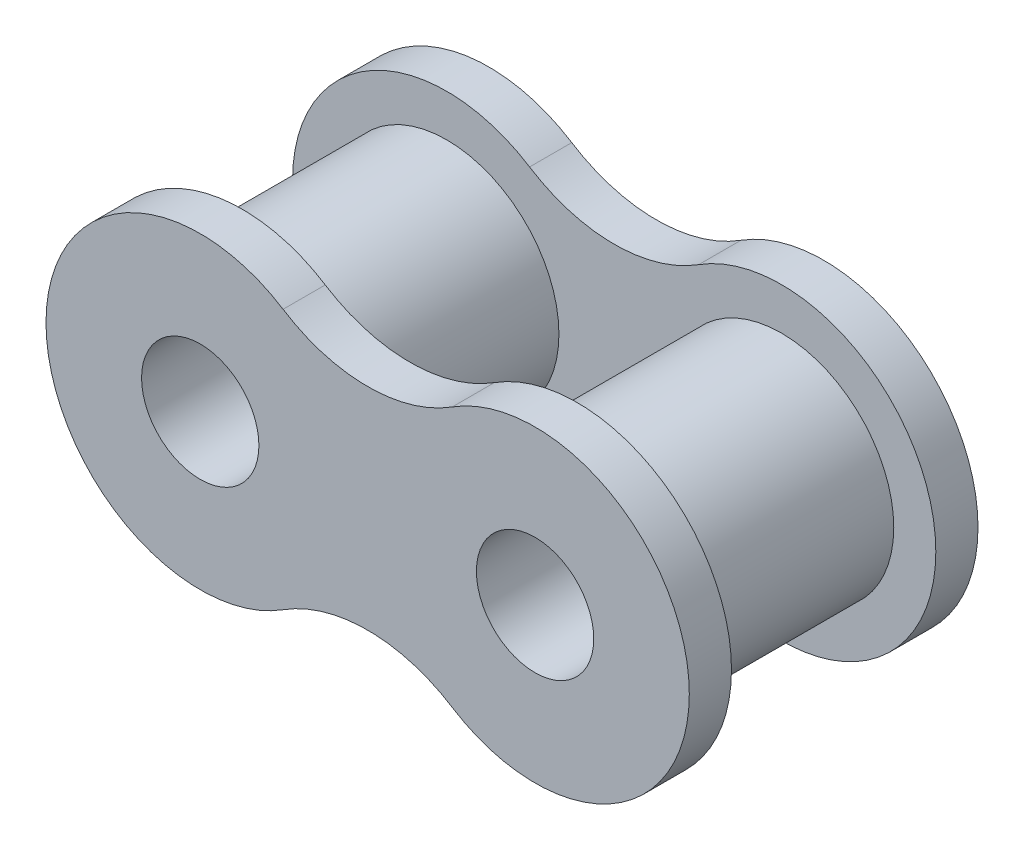
ISO-10303-21;
HEADER;
FILE_DESCRIPTION(('STEP AP214'),'2;1');
FILE_NAME('part.step','',(''),(''),'','','');
FILE_SCHEMA(('AUTOMOTIVE_DESIGN { 1 0 10303 214 1 1 1 1 }'));
ENDSEC;
DATA;
#1=APPLICATION_CONTEXT('core data for automotive mechanical design processes');
#2=APPLICATION_PROTOCOL_DEFINITION('international standard','automotive_design',2000,#1);
#3=PRODUCT_CONTEXT('',#1,'mechanical');
#4=PRODUCT('Part','Part','',(#3));
#5=PRODUCT_RELATED_PRODUCT_CATEGORY('part','',(#4));
#6=PRODUCT_DEFINITION_FORMATION('','',#4);
#7=PRODUCT_DEFINITION_CONTEXT('part definition',#1,'design');
#8=PRODUCT_DEFINITION('design','',#6,#7);
#9=PRODUCT_DEFINITION_SHAPE('','',#8);
#10=(LENGTH_UNIT() NAMED_UNIT(*) SI_UNIT(.MILLI.,.METRE.));
#11=(NAMED_UNIT(*) PLANE_ANGLE_UNIT() SI_UNIT($,.RADIAN.));
#12=(NAMED_UNIT(*) SI_UNIT($,.STERADIAN.) SOLID_ANGLE_UNIT());
#13=UNCERTAINTY_MEASURE_WITH_UNIT(LENGTH_MEASURE(1.E-05),#10,'distance_accuracy_value','');
#14=(GEOMETRIC_REPRESENTATION_CONTEXT(3) GLOBAL_UNCERTAINTY_ASSIGNED_CONTEXT((#13)) GLOBAL_UNIT_ASSIGNED_CONTEXT((#10,
#11,#12)) REPRESENTATION_CONTEXT('',''));
#15=CARTESIAN_POINT('',(0.,0.,0.));
#16=DIRECTION('',(0.,0.,1.));
#17=DIRECTION('',(1.,0.,0.));
#18=AXIS2_PLACEMENT_3D('',#15,#16,#17);
#19=CARTESIAN_POINT('',(-3.175,4.98650250676764,3.875));
#20=DIRECTION('',(0.,0.,1.));
#21=DIRECTION('',(1.,0.,0.));
#22=AXIS2_PLACEMENT_3D('',#19,#20,#21);
#23=PLANE('',#22);
#24=CARTESIAN_POINT('',(0.,0.,3.875));
#25=DIRECTION('',(0.,0.,1.));
#26=DIRECTION('',(1.,0.,0.));
#27=AXIS2_PLACEMENT_3D('',#24,#25,#26);
#28=CIRCLE('',#27,4.255);
#29=CARTESIAN_POINT('',(4.255,0.,3.875));
#30=VERTEX_POINT('',#29);
#31=EDGE_CURVE('E41',#30,#30,#28,.T.);
#32=ORIENTED_EDGE('',*,*,#31,.T.);
#33=EDGE_LOOP('',(#32));
#34=FACE_BOUND('',#33,.T.);
#35=CARTESIAN_POINT('',(-6.35,9.97300501353529,3.875));
#36=DIRECTION('',(0.,0.,-1.));
#37=DIRECTION('',(1.,0.,0.));
#38=AXIS2_PLACEMENT_3D('',#35,#36,#37);
#39=CIRCLE('',#38,5.973);
#40=CARTESIAN_POINT('',(-3.14196904339,4.93462567277184,3.875));
#41=VERTEX_POINT('',#40);
#42=CARTESIAN_POINT('',(-9.55803095661,4.93462567277184,3.875));
#43=VERTEX_POINT('',#42);
#44=EDGE_CURVE('E151',#41,#43,#39,.T.);
#45=ORIENTED_EDGE('',*,*,#44,.F.);
#46=CARTESIAN_POINT('',(0.,0.,3.875));
#47=DIRECTION('',(0.,0.,1.));
#48=DIRECTION('',(1.,0.,0.));
#49=AXIS2_PLACEMENT_3D('',#46,#47,#48);
#50=CIRCLE('',#49,5.85);
#51=CARTESIAN_POINT('',(-3.14196904339,-4.93462567277184,3.875));
#52=VERTEX_POINT('',#51);
#53=EDGE_CURVE('E73',#52,#41,#50,.T.);
#54=ORIENTED_EDGE('',*,*,#53,.F.);
#55=CARTESIAN_POINT('',(-6.35,-9.97300501353529,3.875));
#56=DIRECTION('',(0.,0.,-1.));
#57=DIRECTION('',(-1.,0.,0.));
#58=AXIS2_PLACEMENT_3D('',#55,#56,#57);
#59=CIRCLE('',#58,5.973);
#60=CARTESIAN_POINT('',(-9.55803095661,-4.93462567277184,3.875));
#61=VERTEX_POINT('',#60);
#62=EDGE_CURVE('E67',#61,#52,#59,.T.);
#63=ORIENTED_EDGE('',*,*,#62,.F.);
#64=CARTESIAN_POINT('',(-12.7,0.,3.875));
#65=DIRECTION('',(0.,0.,1.));
#66=DIRECTION('',(1.,0.,0.));
#67=AXIS2_PLACEMENT_3D('',#64,#65,#66);
#68=CIRCLE('',#67,5.85);
#69=EDGE_CURVE('E161',#43,#61,#68,.T.);
#70=ORIENTED_EDGE('',*,*,#69,.F.);
#71=EDGE_LOOP('',(#45,#54,#63,#70));
#72=FACE_BOUND('',#71,.T.);
#73=CARTESIAN_POINT('',(-12.7,0.,3.875));
#74=DIRECTION('',(0.,0.,1.));
#75=DIRECTION('',(1.,0.,0.));
#76=AXIS2_PLACEMENT_3D('',#73,#74,#75);
#77=CIRCLE('',#76,4.255);
#78=CARTESIAN_POINT('',(-8.445,0.,3.875));
#79=VERTEX_POINT('',#78);
#80=EDGE_CURVE('E11',#79,#79,#77,.F.);
#81=ORIENTED_EDGE('',*,*,#80,.F.);
#82=EDGE_LOOP('',(#81));
#83=FACE_BOUND('',#82,.T.);
#84=ADVANCED_FACE('F32',(#34,#72,#83),#23,.F.);
#85=CARTESIAN_POINT('',(0.,0.,3.875));
#86=DIRECTION('',(0.,0.,-1.));
#87=DIRECTION('',(-1.,0.,0.));
#88=AXIS2_PLACEMENT_3D('',#85,#86,#87);
#89=CYLINDRICAL_SURFACE('',#88,4.255);
#90=ORIENTED_EDGE('',*,*,#31,.F.);
#91=EDGE_LOOP('',(#90));
#92=FACE_BOUND('',#91,.T.);
#93=CARTESIAN_POINT('',(0.,0.,-3.875));
#94=DIRECTION('',(0.,0.,-1.));
#95=DIRECTION('',(-1.,0.,0.));
#96=AXIS2_PLACEMENT_3D('',#93,#94,#95);
#97=CIRCLE('',#96,4.255);
#98=CARTESIAN_POINT('',(-4.255,0.,-3.875));
#99=VERTEX_POINT('',#98);
#100=EDGE_CURVE('E137',#99,#99,#97,.T.);
#101=ORIENTED_EDGE('',*,*,#100,.F.);
#102=EDGE_LOOP('',(#101));
#103=FACE_BOUND('',#102,.T.);
#104=ADVANCED_FACE('F34',(#92,#103),#89,.T.);
#105=CARTESIAN_POINT('',(0.,0.,3.875));
#106=DIRECTION('',(0.,0.,-1.));
#107=DIRECTION('',(-1.,0.,0.));
#108=AXIS2_PLACEMENT_3D('',#105,#106,#107);
#109=CYLINDRICAL_SURFACE('',#108,2.225);
#110=CARTESIAN_POINT('',(0.,0.,5.475));
#111=DIRECTION('',(0.,0.,1.));
#112=DIRECTION('',(1.,0.,0.));
#113=AXIS2_PLACEMENT_3D('',#110,#111,#112);
#114=CIRCLE('',#113,2.225);
#115=CARTESIAN_POINT('',(2.225,0.,5.475));
#116=VERTEX_POINT('',#115);
#117=EDGE_CURVE('E148',#116,#116,#114,.T.);
#118=ORIENTED_EDGE('',*,*,#117,.T.);
#119=EDGE_LOOP('',(#118));
#120=FACE_BOUND('',#119,.T.);
#121=CARTESIAN_POINT('',(0.,0.,-5.475));
#122=DIRECTION('',(0.,0.,-1.));
#123=DIRECTION('',(-1.,0.,0.));
#124=AXIS2_PLACEMENT_3D('',#121,#122,#123);
#125=CIRCLE('',#124,2.225);
#126=CARTESIAN_POINT('',(-2.225,0.,-5.475));
#127=VERTEX_POINT('',#126);
#128=EDGE_CURVE('E227',#127,#127,#125,.T.);
#129=ORIENTED_EDGE('',*,*,#128,.T.);
#130=EDGE_LOOP('',(#129));
#131=FACE_BOUND('',#130,.T.);
#132=ADVANCED_FACE('F178',(#120,#131),#109,.F.);
#133=CARTESIAN_POINT('',(-3.175,4.98650250676764,5.475));
#134=DIRECTION('',(0.,0.,1.));
#135=DIRECTION('',(1.,0.,0.));
#136=AXIS2_PLACEMENT_3D('',#133,#134,#135);
#137=PLANE('',#136);
#138=ORIENTED_EDGE('',*,*,#117,.F.);
#139=EDGE_LOOP('',(#138));
#140=FACE_BOUND('',#139,.T.);
#141=CARTESIAN_POINT('',(-6.35,9.97300501353529,5.475));
#142=DIRECTION('',(0.,0.,-1.));
#143=DIRECTION('',(1.,0.,0.));
#144=AXIS2_PLACEMENT_3D('',#141,#142,#143);
#145=CIRCLE('',#144,5.973);
#146=CARTESIAN_POINT('',(-3.14196904339,4.93462567277184,5.475));
#147=VERTEX_POINT('',#146);
#148=CARTESIAN_POINT('',(-9.55803095661,4.93462567277184,5.475));
#149=VERTEX_POINT('',#148);
#150=EDGE_CURVE('E152',#147,#149,#145,.T.);
#151=ORIENTED_EDGE('',*,*,#150,.T.);
#152=CARTESIAN_POINT('',(-12.7,0.,5.475));
#153=DIRECTION('',(0.,0.,1.));
#154=DIRECTION('',(1.,0.,0.));
#155=AXIS2_PLACEMENT_3D('',#152,#153,#154);
#156=CIRCLE('',#155,5.85);
#157=CARTESIAN_POINT('',(-9.55803095661,-4.93462567277184,5.475));
#158=VERTEX_POINT('',#157);
#159=EDGE_CURVE('E81',#149,#158,#156,.T.);
#160=ORIENTED_EDGE('',*,*,#159,.T.);
#161=CARTESIAN_POINT('',(-6.35,-9.97300501353529,5.475));
#162=DIRECTION('',(0.,0.,-1.));
#163=DIRECTION('',(-1.,0.,0.));
#164=AXIS2_PLACEMENT_3D('',#161,#162,#163);
#165=CIRCLE('',#164,5.973);
#166=CARTESIAN_POINT('',(-3.14196904339,-4.93462567277184,5.475));
#167=VERTEX_POINT('',#166);
#168=EDGE_CURVE('E155',#158,#167,#165,.T.);
#169=ORIENTED_EDGE('',*,*,#168,.T.);
#170=CARTESIAN_POINT('',(0.,0.,5.475));
#171=DIRECTION('',(0.,0.,1.));
#172=DIRECTION('',(1.,0.,0.));
#173=AXIS2_PLACEMENT_3D('',#170,#171,#172);
#174=CIRCLE('',#173,5.85);
#175=EDGE_CURVE('E49',#167,#147,#174,.T.);
#176=ORIENTED_EDGE('',*,*,#175,.T.);
#177=EDGE_LOOP('',(#151,#160,#169,#176));
#178=FACE_BOUND('',#177,.T.);
#179=CARTESIAN_POINT('',(-12.7,0.,5.475));
#180=DIRECTION('',(0.,0.,1.));
#181=DIRECTION('',(1.,0.,0.));
#182=AXIS2_PLACEMENT_3D('',#179,#180,#181);
#183=CIRCLE('',#182,2.225);
#184=CARTESIAN_POINT('',(-10.475,0.,5.475));
#185=VERTEX_POINT('',#184);
#186=EDGE_CURVE('E145',#185,#185,#183,.T.);
#187=ORIENTED_EDGE('',*,*,#186,.F.);
#188=EDGE_LOOP('',(#187));
#189=FACE_BOUND('',#188,.T.);
#190=ADVANCED_FACE('F203',(#140,#178,#189),#137,.T.);
#191=CARTESIAN_POINT('',(-6.35,9.97300501353529,5.475));
#192=DIRECTION('',(0.,0.,-1.));
#193=DIRECTION('',(-1.,0.,0.));
#194=AXIS2_PLACEMENT_3D('',#191,#192,#193);
#195=CYLINDRICAL_SURFACE('',#194,5.973);
#196=ORIENTED_EDGE('',*,*,#44,.T.);
#197=DIRECTION('',(0.,0.,-1.));
#198=VECTOR('',#197,1.);
#199=CARTESIAN_POINT('',(-9.55803095661,4.93462567277184,5.475));
#200=LINE('',#199,#198);
#201=EDGE_CURVE('E170',#149,#43,#200,.T.);
#202=ORIENTED_EDGE('',*,*,#201,.F.);
#203=ORIENTED_EDGE('',*,*,#150,.F.);
#204=DIRECTION('',(0.,0.,-1.));
#205=VECTOR('',#204,1.);
#206=CARTESIAN_POINT('',(-3.14196904339,4.93462567277184,5.475));
#207=LINE('',#206,#205);
#208=EDGE_CURVE('E158',#147,#41,#207,.T.);
#209=ORIENTED_EDGE('',*,*,#208,.T.);
#210=EDGE_LOOP('',(#196,#202,#203,#209));
#211=FACE_BOUND('',#210,.T.);
#212=ADVANCED_FACE('F214',(#211),#195,.F.);
#213=CARTESIAN_POINT('',(-12.7,0.,5.475));
#214=DIRECTION('',(0.,0.,-1.));
#215=DIRECTION('',(-1.,0.,0.));
#216=AXIS2_PLACEMENT_3D('',#213,#214,#215);
#217=CYLINDRICAL_SURFACE('',#216,5.85);
#218=ORIENTED_EDGE('',*,*,#69,.T.);
#219=DIRECTION('',(0.,0.,-1.));
#220=VECTOR('',#219,1.);
#221=CARTESIAN_POINT('',(-9.55803095661,-4.93462567277184,5.475));
#222=LINE('',#221,#220);
#223=EDGE_CURVE('E168',#158,#61,#222,.T.);
#224=ORIENTED_EDGE('',*,*,#223,.F.);
#225=ORIENTED_EDGE('',*,*,#159,.F.);
#226=ORIENTED_EDGE('',*,*,#201,.T.);
#227=EDGE_LOOP('',(#218,#224,#225,#226));
#228=FACE_BOUND('',#227,.T.);
#229=ADVANCED_FACE('F211',(#228),#217,.T.);
#230=CARTESIAN_POINT('',(-6.35,-9.97300501353529,5.475));
#231=DIRECTION('',(0.,0.,-1.));
#232=DIRECTION('',(-1.,0.,0.));
#233=AXIS2_PLACEMENT_3D('',#230,#231,#232);
#234=CYLINDRICAL_SURFACE('',#233,5.973);
#235=ORIENTED_EDGE('',*,*,#62,.T.);
#236=DIRECTION('',(0.,0.,-1.));
#237=VECTOR('',#236,1.);
#238=CARTESIAN_POINT('',(-3.14196904339,-4.93462567277184,5.475));
#239=LINE('',#238,#237);
#240=EDGE_CURVE('E166',#167,#52,#239,.T.);
#241=ORIENTED_EDGE('',*,*,#240,.F.);
#242=ORIENTED_EDGE('',*,*,#168,.F.);
#243=ORIENTED_EDGE('',*,*,#223,.T.);
#244=EDGE_LOOP('',(#235,#241,#242,#243));
#245=FACE_BOUND('',#244,.T.);
#246=ADVANCED_FACE('F208',(#245),#234,.F.);
#247=CARTESIAN_POINT('',(0.,0.,5.475));
#248=DIRECTION('',(0.,0.,-1.));
#249=DIRECTION('',(-1.,0.,0.));
#250=AXIS2_PLACEMENT_3D('',#247,#248,#249);
#251=CYLINDRICAL_SURFACE('',#250,5.85);
#252=ORIENTED_EDGE('',*,*,#53,.T.);
#253=ORIENTED_EDGE('',*,*,#208,.F.);
#254=ORIENTED_EDGE('',*,*,#175,.F.);
#255=ORIENTED_EDGE('',*,*,#240,.T.);
#256=EDGE_LOOP('',(#252,#253,#254,#255));
#257=FACE_BOUND('',#256,.T.);
#258=ADVANCED_FACE('F205',(#257),#251,.T.);
#259=CARTESIAN_POINT('',(-12.7,0.,5.475));
#260=DIRECTION('',(0.,0.,-1.));
#261=DIRECTION('',(-1.,0.,0.));
#262=AXIS2_PLACEMENT_3D('',#259,#260,#261);
#263=CYLINDRICAL_SURFACE('',#262,2.225);
#264=ORIENTED_EDGE('',*,*,#186,.T.);
#265=EDGE_LOOP('',(#264));
#266=FACE_BOUND('',#265,.T.);
#267=CARTESIAN_POINT('',(-12.7,0.,-5.475));
#268=DIRECTION('',(0.,0.,-1.));
#269=DIRECTION('',(-1.,0.,0.));
#270=AXIS2_PLACEMENT_3D('',#267,#268,#269);
#271=CIRCLE('',#270,2.225);
#272=CARTESIAN_POINT('',(-14.925,0.,-5.475));
#273=VERTEX_POINT('',#272);
#274=EDGE_CURVE('E228',#273,#273,#271,.T.);
#275=ORIENTED_EDGE('',*,*,#274,.T.);
#276=EDGE_LOOP('',(#275));
#277=FACE_BOUND('',#276,.T.);
#278=ADVANCED_FACE('F192',(#266,#277),#263,.F.);
#279=CARTESIAN_POINT('',(-12.7,0.,3.875));
#280=DIRECTION('',(0.,0.,-1.));
#281=DIRECTION('',(-1.,0.,0.));
#282=AXIS2_PLACEMENT_3D('',#279,#280,#281);
#283=CYLINDRICAL_SURFACE('',#282,4.255);
#284=ORIENTED_EDGE('',*,*,#80,.T.);
#285=EDGE_LOOP('',(#284));
#286=FACE_BOUND('',#285,.T.);
#287=CARTESIAN_POINT('',(-12.7,0.,-3.875));
#288=DIRECTION('',(0.,0.,-1.));
#289=DIRECTION('',(-1.,0.,0.));
#290=AXIS2_PLACEMENT_3D('',#287,#288,#289);
#291=CIRCLE('',#290,4.255);
#292=CARTESIAN_POINT('',(-16.955,0.,-3.875));
#293=VERTEX_POINT('',#292);
#294=EDGE_CURVE('E134',#293,#293,#291,.T.);
#295=ORIENTED_EDGE('',*,*,#294,.F.);
#296=EDGE_LOOP('',(#295));
#297=FACE_BOUND('',#296,.T.);
#298=ADVANCED_FACE('F183',(#286,#297),#283,.T.);
#299=CARTESIAN_POINT('',(-9.525,4.98650250676765,-3.875));
#300=DIRECTION('',(0.,0.,-1.));
#301=DIRECTION('',(-1.,0.,0.));
#302=AXIS2_PLACEMENT_3D('',#299,#300,#301);
#303=PLANE('',#302);
#304=ORIENTED_EDGE('',*,*,#294,.T.);
#305=EDGE_LOOP('',(#304));
#306=FACE_BOUND('',#305,.T.);
#307=CARTESIAN_POINT('',(-6.35,9.9730050135353,-3.875));
#308=DIRECTION('',(0.,0.,1.));
#309=DIRECTION('',(-1.,0.,0.));
#310=AXIS2_PLACEMENT_3D('',#307,#308,#309);
#311=CIRCLE('',#310,5.97300000000001);
#312=CARTESIAN_POINT('',(-9.55803095661,4.93462567277184,-3.875));
#313=VERTEX_POINT('',#312);
#314=CARTESIAN_POINT('',(-3.14196904339,4.93462567277184,-3.875));
#315=VERTEX_POINT('',#314);
#316=EDGE_CURVE('E133',#313,#315,#311,.T.);
#317=ORIENTED_EDGE('',*,*,#316,.F.);
#318=CARTESIAN_POINT('',(-12.7,0.,-3.875));
#319=DIRECTION('',(0.,0.,-1.));
#320=DIRECTION('',(-1.,0.,0.));
#321=AXIS2_PLACEMENT_3D('',#318,#319,#320);
#322=CIRCLE('',#321,5.85);
#323=CARTESIAN_POINT('',(-9.55803095661,-4.93462567277184,-3.875));
#324=VERTEX_POINT('',#323);
#325=EDGE_CURVE('E129',#324,#313,#322,.T.);
#326=ORIENTED_EDGE('',*,*,#325,.F.);
#327=CARTESIAN_POINT('',(-6.35,-9.9730050135353,-3.875));
#328=DIRECTION('',(0.,0.,1.));
#329=DIRECTION('',(1.,0.,0.));
#330=AXIS2_PLACEMENT_3D('',#327,#328,#329);
#331=CIRCLE('',#330,5.97300000000001);
#332=CARTESIAN_POINT('',(-3.14196904339,-4.93462567277184,-3.875));
#333=VERTEX_POINT('',#332);
#334=EDGE_CURVE('E239',#333,#324,#331,.T.);
#335=ORIENTED_EDGE('',*,*,#334,.F.);
#336=CARTESIAN_POINT('',(0.,0.,-3.875));
#337=DIRECTION('',(0.,0.,-1.));
#338=DIRECTION('',(-1.,0.,0.));
#339=AXIS2_PLACEMENT_3D('',#336,#337,#338);
#340=CIRCLE('',#339,5.85);
#341=EDGE_CURVE('E230',#315,#333,#340,.T.);
#342=ORIENTED_EDGE('',*,*,#341,.F.);
#343=EDGE_LOOP('',(#317,#326,#335,#342));
#344=FACE_BOUND('',#343,.T.);
#345=ORIENTED_EDGE('',*,*,#100,.T.);
#346=EDGE_LOOP('',(#345));
#347=FACE_BOUND('',#346,.T.);
#348=ADVANCED_FACE('F181',(#306,#344,#347),#303,.F.);
#349=CARTESIAN_POINT('',(-9.525,4.98650250676765,-5.475));
#350=DIRECTION('',(0.,0.,-1.));
#351=DIRECTION('',(-1.,0.,0.));
#352=AXIS2_PLACEMENT_3D('',#349,#350,#351);
#353=PLANE('',#352);
#354=ORIENTED_EDGE('',*,*,#128,.F.);
#355=EDGE_LOOP('',(#354));
#356=FACE_BOUND('',#355,.T.);
#357=CARTESIAN_POINT('',(-6.35,9.9730050135353,-5.475));
#358=DIRECTION('',(0.,0.,1.));
#359=DIRECTION('',(-1.,0.,0.));
#360=AXIS2_PLACEMENT_3D('',#357,#358,#359);
#361=CIRCLE('',#360,5.97300000000001);
#362=CARTESIAN_POINT('',(-9.55803095661,4.93462567277184,-5.475));
#363=VERTEX_POINT('',#362);
#364=CARTESIAN_POINT('',(-3.14196904339,4.93462567277184,-5.475));
#365=VERTEX_POINT('',#364);
#366=EDGE_CURVE('E119',#363,#365,#361,.T.);
#367=ORIENTED_EDGE('',*,*,#366,.T.);
#368=CARTESIAN_POINT('',(0.,0.,-5.475));
#369=DIRECTION('',(0.,0.,-1.));
#370=DIRECTION('',(-1.,0.,0.));
#371=AXIS2_PLACEMENT_3D('',#368,#369,#370);
#372=CIRCLE('',#371,5.85);
#373=CARTESIAN_POINT('',(-3.14196904339,-4.93462567277184,-5.475));
#374=VERTEX_POINT('',#373);
#375=EDGE_CURVE('E108',#365,#374,#372,.T.);
#376=ORIENTED_EDGE('',*,*,#375,.T.);
#377=CARTESIAN_POINT('',(-6.35,-9.9730050135353,-5.475));
#378=DIRECTION('',(0.,0.,1.));
#379=DIRECTION('',(1.,0.,0.));
#380=AXIS2_PLACEMENT_3D('',#377,#378,#379);
#381=CIRCLE('',#380,5.97300000000001);
#382=CARTESIAN_POINT('',(-9.55803095661,-4.93462567277184,-5.475));
#383=VERTEX_POINT('',#382);
#384=EDGE_CURVE('E118',#374,#383,#381,.T.);
#385=ORIENTED_EDGE('',*,*,#384,.T.);
#386=CARTESIAN_POINT('',(-12.7,0.,-5.475));
#387=DIRECTION('',(0.,0.,-1.));
#388=DIRECTION('',(-1.,0.,0.));
#389=AXIS2_PLACEMENT_3D('',#386,#387,#388);
#390=CIRCLE('',#389,5.85);
#391=EDGE_CURVE('E125',#383,#363,#390,.T.);
#392=ORIENTED_EDGE('',*,*,#391,.T.);
#393=EDGE_LOOP('',(#367,#376,#385,#392));
#394=FACE_BOUND('',#393,.T.);
#395=ORIENTED_EDGE('',*,*,#274,.F.);
#396=EDGE_LOOP('',(#395));
#397=FACE_BOUND('',#396,.T.);
#398=ADVANCED_FACE('F122',(#356,#394,#397),#353,.T.);
#399=CARTESIAN_POINT('',(-6.35,9.9730050135353,-5.475));
#400=DIRECTION('',(0.,0.,1.));
#401=DIRECTION('',(1.,0.,0.));
#402=AXIS2_PLACEMENT_3D('',#399,#400,#401);
#403=CYLINDRICAL_SURFACE('',#402,5.97300000000001);
#404=ORIENTED_EDGE('',*,*,#316,.T.);
#405=DIRECTION('',(0.,0.,1.));
#406=VECTOR('',#405,1.);
#407=CARTESIAN_POINT('',(-3.14196904339,4.93462567277184,-5.475));
#408=LINE('',#407,#406);
#409=EDGE_CURVE('E112',#365,#315,#408,.T.);
#410=ORIENTED_EDGE('',*,*,#409,.F.);
#411=ORIENTED_EDGE('',*,*,#366,.F.);
#412=DIRECTION('',(0.,0.,1.));
#413=VECTOR('',#412,1.);
#414=CARTESIAN_POINT('',(-9.55803095661,4.93462567277184,-5.475));
#415=LINE('',#414,#413);
#416=EDGE_CURVE('E236',#363,#313,#415,.T.);
#417=ORIENTED_EDGE('',*,*,#416,.T.);
#418=EDGE_LOOP('',(#404,#410,#411,#417));
#419=FACE_BOUND('',#418,.T.);
#420=ADVANCED_FACE('F131',(#419),#403,.F.);
#421=CARTESIAN_POINT('',(0.,0.,-5.475));
#422=DIRECTION('',(0.,0.,1.));
#423=DIRECTION('',(1.,0.,0.));
#424=AXIS2_PLACEMENT_3D('',#421,#422,#423);
#425=CYLINDRICAL_SURFACE('',#424,5.85);
#426=ORIENTED_EDGE('',*,*,#341,.T.);
#427=DIRECTION('',(0.,0.,1.));
#428=VECTOR('',#427,1.);
#429=CARTESIAN_POINT('',(-3.14196904339,-4.93462567277184,-5.475));
#430=LINE('',#429,#428);
#431=EDGE_CURVE('E115',#374,#333,#430,.T.);
#432=ORIENTED_EDGE('',*,*,#431,.F.);
#433=ORIENTED_EDGE('',*,*,#375,.F.);
#434=ORIENTED_EDGE('',*,*,#409,.T.);
#435=EDGE_LOOP('',(#426,#432,#433,#434));
#436=FACE_BOUND('',#435,.T.);
#437=ADVANCED_FACE('F110',(#436),#425,.T.);
#438=CARTESIAN_POINT('',(-6.35,-9.9730050135353,-5.475));
#439=DIRECTION('',(0.,0.,1.));
#440=DIRECTION('',(1.,0.,0.));
#441=AXIS2_PLACEMENT_3D('',#438,#439,#440);
#442=CYLINDRICAL_SURFACE('',#441,5.97300000000001);
#443=ORIENTED_EDGE('',*,*,#334,.T.);
#444=DIRECTION('',(0.,0.,1.));
#445=VECTOR('',#444,1.);
#446=CARTESIAN_POINT('',(-9.55803095661,-4.93462567277184,-5.475));
#447=LINE('',#446,#445);
#448=EDGE_CURVE('E139',#383,#324,#447,.T.);
#449=ORIENTED_EDGE('',*,*,#448,.F.);
#450=ORIENTED_EDGE('',*,*,#384,.F.);
#451=ORIENTED_EDGE('',*,*,#431,.T.);
#452=EDGE_LOOP('',(#443,#449,#450,#451));
#453=FACE_BOUND('',#452,.T.);
#454=ADVANCED_FACE('F249',(#453),#442,.F.);
#455=CARTESIAN_POINT('',(-12.7,0.,-5.475));
#456=DIRECTION('',(0.,0.,1.));
#457=DIRECTION('',(1.,0.,0.));
#458=AXIS2_PLACEMENT_3D('',#455,#456,#457);
#459=CYLINDRICAL_SURFACE('',#458,5.85);
#460=ORIENTED_EDGE('',*,*,#325,.T.);
#461=ORIENTED_EDGE('',*,*,#416,.F.);
#462=ORIENTED_EDGE('',*,*,#391,.F.);
#463=ORIENTED_EDGE('',*,*,#448,.T.);
#464=EDGE_LOOP('',(#460,#461,#462,#463));
#465=FACE_BOUND('',#464,.T.);
#466=ADVANCED_FACE('F246',(#465),#459,.T.);
#467=CLOSED_SHELL('',(#84,#104,#132,#190,#212,#229,#246,#258,#278,#298,#348,#398,#420,#437,#454,#466));
#468=MANIFOLD_SOLID_BREP('B2',#467);
#469=ADVANCED_BREP_SHAPE_REPRESENTATION('',(#18,#468),#14);
#470=SHAPE_DEFINITION_REPRESENTATION(#9,#469);
ENDSEC;
END-ISO-10303-21;
